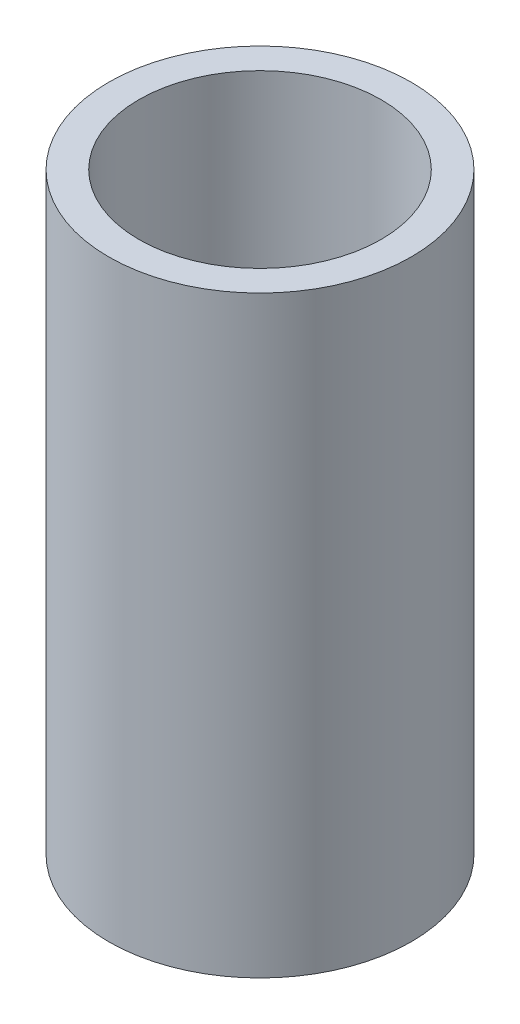
ISO-10303-21;
HEADER;
FILE_DESCRIPTION(('STEP AP214'),'2;1');
FILE_NAME('part.step','',(''),(''),'','','');
FILE_SCHEMA(('AUTOMOTIVE_DESIGN { 1 0 10303 214 1 1 1 1 }'));
ENDSEC;
DATA;
#1=APPLICATION_CONTEXT('core data for automotive mechanical design processes');
#2=APPLICATION_PROTOCOL_DEFINITION('international standard','automotive_design',2000,#1);
#3=PRODUCT_CONTEXT('',#1,'mechanical');
#4=PRODUCT('Part','Part','',(#3));
#5=PRODUCT_RELATED_PRODUCT_CATEGORY('part','',(#4));
#6=PRODUCT_DEFINITION_FORMATION('','',#4);
#7=PRODUCT_DEFINITION_CONTEXT('part definition',#1,'design');
#8=PRODUCT_DEFINITION('design','',#6,#7);
#9=PRODUCT_DEFINITION_SHAPE('','',#8);
#10=(LENGTH_UNIT() NAMED_UNIT(*) SI_UNIT(.MILLI.,.METRE.));
#11=(NAMED_UNIT(*) PLANE_ANGLE_UNIT() SI_UNIT($,.RADIAN.));
#12=(NAMED_UNIT(*) SI_UNIT($,.STERADIAN.) SOLID_ANGLE_UNIT());
#13=UNCERTAINTY_MEASURE_WITH_UNIT(LENGTH_MEASURE(1.E-05),#10,'distance_accuracy_value','');
#14=(GEOMETRIC_REPRESENTATION_CONTEXT(3) GLOBAL_UNCERTAINTY_ASSIGNED_CONTEXT((#13)) GLOBAL_UNIT_ASSIGNED_CONTEXT((#10,
#11,#12)) REPRESENTATION_CONTEXT('',''));
#15=CARTESIAN_POINT('',(0.,0.,0.));
#16=DIRECTION('',(0.,0.,1.));
#17=DIRECTION('',(1.,0.,0.));
#18=AXIS2_PLACEMENT_3D('',#15,#16,#17);
#19=CARTESIAN_POINT('',(0.,29.5,0.));
#20=DIRECTION('',(0.,1.,0.));
#21=DIRECTION('',(0.,0.,1.));
#22=AXIS2_PLACEMENT_3D('',#19,#20,#21);
#23=PLANE('',#22);
#24=CARTESIAN_POINT('',(0.,29.5,0.));
#25=DIRECTION('',(0.,1.,0.));
#26=DIRECTION('',(0.,0.,1.));
#27=AXIS2_PLACEMENT_3D('',#24,#25,#26);
#28=CIRCLE('',#27,7.525);
#29=CARTESIAN_POINT('',(0.,29.5,7.525));
#30=VERTEX_POINT('',#29);
#31=EDGE_CURVE('E10',#30,#30,#28,.T.);
#32=ORIENTED_EDGE('',*,*,#31,.T.);
#33=EDGE_LOOP('',(#32));
#34=FACE_BOUND('',#33,.T.);
#35=CARTESIAN_POINT('',(0.,29.5,0.));
#36=DIRECTION('',(0.,1.,0.));
#37=DIRECTION('',(0.,0.,1.));
#38=AXIS2_PLACEMENT_3D('',#35,#36,#37);
#39=CIRCLE('',#38,6.025);
#40=CARTESIAN_POINT('',(0.,29.5,6.025));
#41=VERTEX_POINT('',#40);
#42=EDGE_CURVE('E45',#41,#41,#39,.T.);
#43=ORIENTED_EDGE('',*,*,#42,.F.);
#44=EDGE_LOOP('',(#43));
#45=FACE_BOUND('',#44,.T.);
#46=ADVANCED_FACE('F34',(#34,#45),#23,.T.);
#47=CARTESIAN_POINT('',(0.,0.,0.));
#48=DIRECTION('',(0.,1.,0.));
#49=DIRECTION('',(0.,0.,1.));
#50=AXIS2_PLACEMENT_3D('',#47,#48,#49);
#51=PLANE('',#50);
#52=CARTESIAN_POINT('',(0.,0.,0.));
#53=DIRECTION('',(0.,1.,0.));
#54=DIRECTION('',(0.,0.,1.));
#55=AXIS2_PLACEMENT_3D('',#52,#53,#54);
#56=CIRCLE('',#55,7.525);
#57=CARTESIAN_POINT('',(0.,0.,7.525));
#58=VERTEX_POINT('',#57);
#59=EDGE_CURVE('E38',#58,#58,#56,.T.);
#60=ORIENTED_EDGE('',*,*,#59,.F.);
#61=EDGE_LOOP('',(#60));
#62=FACE_BOUND('',#61,.T.);
#63=CARTESIAN_POINT('',(0.,0.,0.));
#64=DIRECTION('',(0.,1.,0.));
#65=DIRECTION('',(0.,0.,1.));
#66=AXIS2_PLACEMENT_3D('',#63,#64,#65);
#67=CIRCLE('',#66,6.025);
#68=CARTESIAN_POINT('',(0.,0.,6.025));
#69=VERTEX_POINT('',#68);
#70=EDGE_CURVE('E47',#69,#69,#67,.T.);
#71=ORIENTED_EDGE('',*,*,#70,.T.);
#72=EDGE_LOOP('',(#71));
#73=FACE_BOUND('',#72,.T.);
#74=ADVANCED_FACE('F57',(#62,#73),#51,.F.);
#75=CARTESIAN_POINT('',(0.,29.5,0.));
#76=DIRECTION('',(0.,-1.,0.));
#77=DIRECTION('',(0.,0.,-1.));
#78=AXIS2_PLACEMENT_3D('',#75,#76,#77);
#79=CYLINDRICAL_SURFACE('',#78,7.525);
#80=ORIENTED_EDGE('',*,*,#31,.F.);
#81=EDGE_LOOP('',(#80));
#82=FACE_BOUND('',#81,.T.);
#83=ORIENTED_EDGE('',*,*,#59,.T.);
#84=EDGE_LOOP('',(#83));
#85=FACE_BOUND('',#84,.T.);
#86=ADVANCED_FACE('F36',(#82,#85),#79,.T.);
#87=CARTESIAN_POINT('',(0.,29.5,0.));
#88=DIRECTION('',(0.,-1.,0.));
#89=DIRECTION('',(0.,0.,-1.));
#90=AXIS2_PLACEMENT_3D('',#87,#88,#89);
#91=CYLINDRICAL_SURFACE('',#90,6.025);
#92=ORIENTED_EDGE('',*,*,#42,.T.);
#93=EDGE_LOOP('',(#92));
#94=FACE_BOUND('',#93,.T.);
#95=ORIENTED_EDGE('',*,*,#70,.F.);
#96=EDGE_LOOP('',(#95));
#97=FACE_BOUND('',#96,.T.);
#98=ADVANCED_FACE('F53',(#94,#97),#91,.F.);
#99=CLOSED_SHELL('',(#46,#74,#86,#98));
#100=MANIFOLD_SOLID_BREP('B2',#99);
#101=ADVANCED_BREP_SHAPE_REPRESENTATION('',(#18,#100),#14);
#102=SHAPE_DEFINITION_REPRESENTATION(#9,#101);
ENDSEC;
END-ISO-10303-21;
